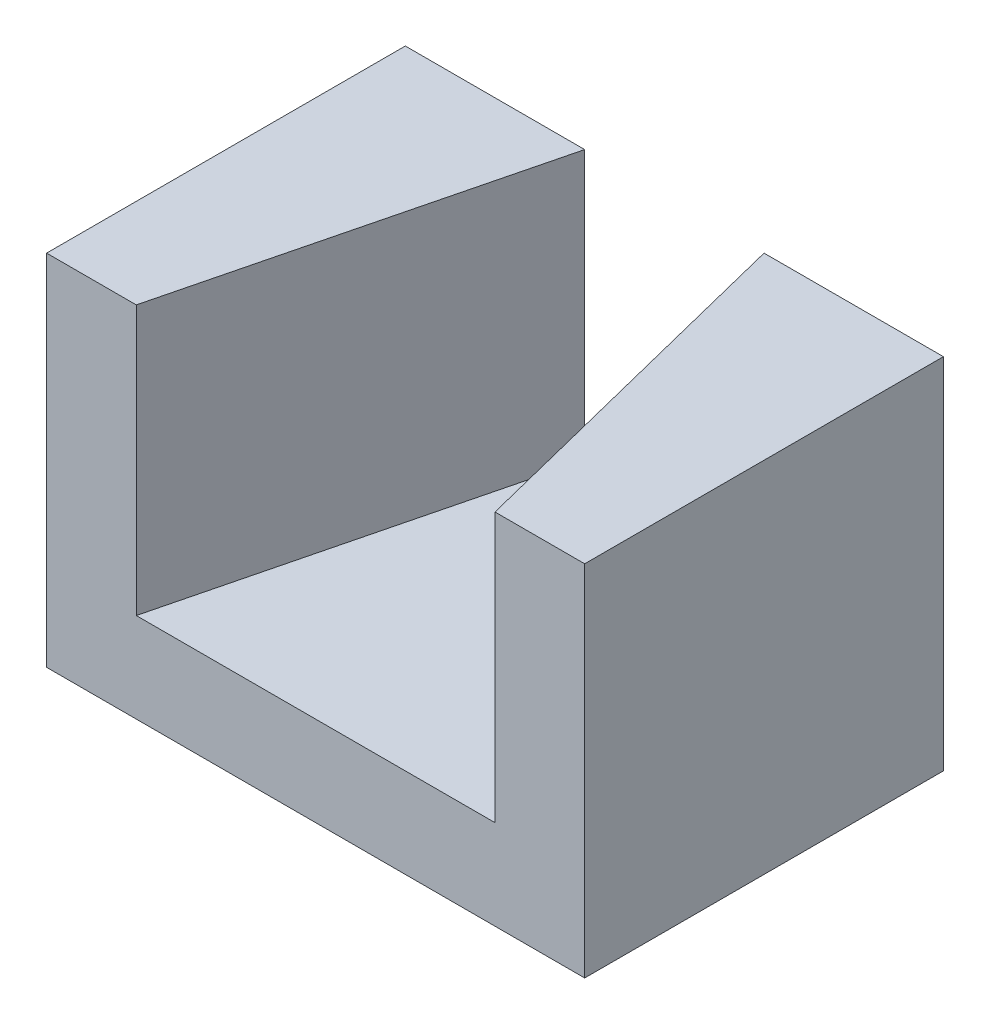
ISO-10303-21;
HEADER;
FILE_DESCRIPTION(('STEP AP214'),'2;1');
FILE_NAME('part.step','',(''),(''),'','','');
FILE_SCHEMA(('AUTOMOTIVE_DESIGN { 1 0 10303 214 1 1 1 1 }'));
ENDSEC;
DATA;
#1=APPLICATION_CONTEXT('core data for automotive mechanical design processes');
#2=APPLICATION_PROTOCOL_DEFINITION('international standard','automotive_design',2000,#1);
#3=PRODUCT_CONTEXT('',#1,'mechanical');
#4=PRODUCT('Part','Part','',(#3));
#5=PRODUCT_RELATED_PRODUCT_CATEGORY('part','',(#4));
#6=PRODUCT_DEFINITION_FORMATION('','',#4);
#7=PRODUCT_DEFINITION_CONTEXT('part definition',#1,'design');
#8=PRODUCT_DEFINITION('design','',#6,#7);
#9=PRODUCT_DEFINITION_SHAPE('','',#8);
#10=(LENGTH_UNIT() NAMED_UNIT(*) SI_UNIT(.MILLI.,.METRE.));
#11=(NAMED_UNIT(*) PLANE_ANGLE_UNIT() SI_UNIT($,.RADIAN.));
#12=(NAMED_UNIT(*) SI_UNIT($,.STERADIAN.) SOLID_ANGLE_UNIT());
#13=UNCERTAINTY_MEASURE_WITH_UNIT(LENGTH_MEASURE(1.E-05),#10,'distance_accuracy_value','');
#14=(GEOMETRIC_REPRESENTATION_CONTEXT(3) GLOBAL_UNCERTAINTY_ASSIGNED_CONTEXT((#13)) GLOBAL_UNIT_ASSIGNED_CONTEXT((#10,
#11,#12)) REPRESENTATION_CONTEXT('',''));
#15=CARTESIAN_POINT('',(0.,0.,0.));
#16=DIRECTION('',(0.,0.,1.));
#17=DIRECTION('',(1.,0.,0.));
#18=AXIS2_PLACEMENT_3D('',#15,#16,#17);
#19=CARTESIAN_POINT('',(0.,-10.,0.));
#20=DIRECTION('',(0.,0.,1.));
#21=DIRECTION('',(1.,0.,0.));
#22=AXIS2_PLACEMENT_3D('',#19,#20,#21);
#23=PLANE('',#22);
#24=DIRECTION('',(1.,0.,0.));
#25=VECTOR('',#24,1.);
#26=CARTESIAN_POINT('',(0.,0.,0.));
#27=LINE('',#26,#25);
#28=CARTESIAN_POINT('',(10.,0.,0.));
#29=VERTEX_POINT('',#28);
#30=CARTESIAN_POINT('',(50.,0.,0.));
#31=VERTEX_POINT('',#30);
#32=EDGE_CURVE('E142',#29,#31,#27,.T.);
#33=ORIENTED_EDGE('',*,*,#32,.F.);
#34=DIRECTION('',(0.,-1.,0.));
#35=VECTOR('',#34,1.);
#36=CARTESIAN_POINT('',(10.,30.,0.));
#37=LINE('',#36,#35);
#38=CARTESIAN_POINT('',(10.,30.,0.));
#39=VERTEX_POINT('',#38);
#40=EDGE_CURVE('E139',#39,#29,#37,.T.);
#41=ORIENTED_EDGE('',*,*,#40,.F.);
#42=DIRECTION('',(1.,0.,0.));
#43=VECTOR('',#42,1.);
#44=CARTESIAN_POINT('',(0.,30.,0.));
#45=LINE('',#44,#43);
#46=CARTESIAN_POINT('',(0.,30.,0.));
#47=VERTEX_POINT('',#46);
#48=EDGE_CURVE('E131',#47,#39,#45,.T.);
#49=ORIENTED_EDGE('',*,*,#48,.F.);
#50=DIRECTION('',(0.,1.,0.));
#51=VECTOR('',#50,1.);
#52=CARTESIAN_POINT('',(0.,-10.,0.));
#53=LINE('',#52,#51);
#54=CARTESIAN_POINT('',(0.,-10.,0.));
#55=VERTEX_POINT('',#54);
#56=EDGE_CURVE('E11',#55,#47,#53,.T.);
#57=ORIENTED_EDGE('',*,*,#56,.F.);
#58=DIRECTION('',(1.,0.,0.));
#59=VECTOR('',#58,1.);
#60=CARTESIAN_POINT('',(0.,-10.,0.));
#61=LINE('',#60,#59);
#62=CARTESIAN_POINT('',(60.,-10.,0.));
#63=VERTEX_POINT('',#62);
#64=EDGE_CURVE('E143',#55,#63,#61,.T.);
#65=ORIENTED_EDGE('',*,*,#64,.T.);
#66=DIRECTION('',(0.,1.,0.));
#67=VECTOR('',#66,1.);
#68=CARTESIAN_POINT('',(60.,-10.,0.));
#69=LINE('',#68,#67);
#70=CARTESIAN_POINT('',(60.,30.,0.));
#71=VERTEX_POINT('',#70);
#72=EDGE_CURVE('E36',#63,#71,#69,.T.);
#73=ORIENTED_EDGE('',*,*,#72,.T.);
#74=DIRECTION('',(1.,0.,0.));
#75=VECTOR('',#74,1.);
#76=CARTESIAN_POINT('',(0.,30.,0.));
#77=LINE('',#76,#75);
#78=CARTESIAN_POINT('',(50.,30.,0.));
#79=VERTEX_POINT('',#78);
#80=EDGE_CURVE('E110',#79,#71,#77,.T.);
#81=ORIENTED_EDGE('',*,*,#80,.F.);
#82=DIRECTION('',(0.,-1.,0.));
#83=VECTOR('',#82,1.);
#84=CARTESIAN_POINT('',(50.,30.,0.));
#85=LINE('',#84,#83);
#86=EDGE_CURVE('E99',#79,#31,#85,.T.);
#87=ORIENTED_EDGE('',*,*,#86,.T.);
#88=EDGE_LOOP('',(#33,#41,#49,#57,#65,#73,#81,#87));
#89=FACE_BOUND('',#88,.T.);
#90=ADVANCED_FACE('F33',(#89),#23,.T.);
#91=CARTESIAN_POINT('',(0.,-10.,0.));
#92=DIRECTION('',(1.,0.,0.));
#93=DIRECTION('',(0.,0.,-1.));
#94=AXIS2_PLACEMENT_3D('',#91,#92,#93);
#95=PLANE('',#94);
#96=ORIENTED_EDGE('',*,*,#56,.T.);
#97=DIRECTION('',(0.,0.,-1.));
#98=VECTOR('',#97,1.);
#99=CARTESIAN_POINT('',(0.,30.,0.));
#100=LINE('',#99,#98);
#101=CARTESIAN_POINT('',(0.,30.,-40.));
#102=VERTEX_POINT('',#101);
#103=EDGE_CURVE('E128',#47,#102,#100,.T.);
#104=ORIENTED_EDGE('',*,*,#103,.T.);
#105=DIRECTION('',(0.,1.,0.));
#106=VECTOR('',#105,1.);
#107=CARTESIAN_POINT('',(0.,-10.,-40.));
#108=LINE('',#107,#106);
#109=CARTESIAN_POINT('',(0.,-10.,-40.));
#110=VERTEX_POINT('',#109);
#111=EDGE_CURVE('E41',#110,#102,#108,.T.);
#112=ORIENTED_EDGE('',*,*,#111,.F.);
#113=DIRECTION('',(0.,0.,-1.));
#114=VECTOR('',#113,1.);
#115=CARTESIAN_POINT('',(0.,-10.,0.));
#116=LINE('',#115,#114);
#117=EDGE_CURVE('E151',#55,#110,#116,.T.);
#118=ORIENTED_EDGE('',*,*,#117,.F.);
#119=EDGE_LOOP('',(#96,#104,#112,#118));
#120=FACE_BOUND('',#119,.T.);
#121=ADVANCED_FACE('F176',(#120),#95,.F.);
#122=CARTESIAN_POINT('',(0.,-10.,-40.));
#123=DIRECTION('',(0.,0.,1.));
#124=DIRECTION('',(1.,0.,0.));
#125=AXIS2_PLACEMENT_3D('',#122,#123,#124);
#126=PLANE('',#125);
#127=ORIENTED_EDGE('',*,*,#111,.T.);
#128=DIRECTION('',(1.,0.,0.));
#129=VECTOR('',#128,1.);
#130=CARTESIAN_POINT('',(0.,30.,-40.));
#131=LINE('',#130,#129);
#132=CARTESIAN_POINT('',(20.,30.,-40.));
#133=VERTEX_POINT('',#132);
#134=EDGE_CURVE('E125',#102,#133,#131,.T.);
#135=ORIENTED_EDGE('',*,*,#134,.T.);
#136=DIRECTION('',(0.,-1.,0.));
#137=VECTOR('',#136,1.);
#138=CARTESIAN_POINT('',(20.,30.,-40.));
#139=LINE('',#138,#137);
#140=CARTESIAN_POINT('',(20.,0.,-40.));
#141=VERTEX_POINT('',#140);
#142=EDGE_CURVE('E135',#133,#141,#139,.T.);
#143=ORIENTED_EDGE('',*,*,#142,.T.);
#144=DIRECTION('',(1.,0.,0.));
#145=VECTOR('',#144,1.);
#146=CARTESIAN_POINT('',(0.,0.,-40.));
#147=LINE('',#146,#145);
#148=CARTESIAN_POINT('',(40.,0.,-40.));
#149=VERTEX_POINT('',#148);
#150=EDGE_CURVE('E146',#141,#149,#147,.T.);
#151=ORIENTED_EDGE('',*,*,#150,.T.);
#152=DIRECTION('',(0.,-1.,0.));
#153=VECTOR('',#152,1.);
#154=CARTESIAN_POINT('',(40.,30.,-40.));
#155=LINE('',#154,#153);
#156=CARTESIAN_POINT('',(40.,30.,-40.));
#157=VERTEX_POINT('',#156);
#158=EDGE_CURVE('E107',#157,#149,#155,.T.);
#159=ORIENTED_EDGE('',*,*,#158,.F.);
#160=DIRECTION('',(1.,0.,0.));
#161=VECTOR('',#160,1.);
#162=CARTESIAN_POINT('',(0.,30.,-40.));
#163=LINE('',#162,#161);
#164=CARTESIAN_POINT('',(60.,30.,-40.));
#165=VERTEX_POINT('',#164);
#166=EDGE_CURVE('E118',#157,#165,#163,.T.);
#167=ORIENTED_EDGE('',*,*,#166,.T.);
#168=DIRECTION('',(0.,1.,0.));
#169=VECTOR('',#168,1.);
#170=CARTESIAN_POINT('',(60.,-10.,-40.));
#171=LINE('',#170,#169);
#172=CARTESIAN_POINT('',(60.,-10.,-40.));
#173=VERTEX_POINT('',#172);
#174=EDGE_CURVE('E156',#173,#165,#171,.T.);
#175=ORIENTED_EDGE('',*,*,#174,.F.);
#176=DIRECTION('',(1.,0.,0.));
#177=VECTOR('',#176,1.);
#178=CARTESIAN_POINT('',(0.,-10.,-40.));
#179=LINE('',#178,#177);
#180=EDGE_CURVE('E149',#110,#173,#179,.T.);
#181=ORIENTED_EDGE('',*,*,#180,.F.);
#182=EDGE_LOOP('',(#127,#135,#143,#151,#159,#167,#175,#181));
#183=FACE_BOUND('',#182,.T.);
#184=ADVANCED_FACE('F163',(#183),#126,.F.);
#185=CARTESIAN_POINT('',(60.,-10.,0.));
#186=DIRECTION('',(1.,0.,0.));
#187=DIRECTION('',(0.,0.,-1.));
#188=AXIS2_PLACEMENT_3D('',#185,#186,#187);
#189=PLANE('',#188);
#190=ORIENTED_EDGE('',*,*,#174,.T.);
#191=DIRECTION('',(0.,0.,-1.));
#192=VECTOR('',#191,1.);
#193=CARTESIAN_POINT('',(60.,30.,0.));
#194=LINE('',#193,#192);
#195=EDGE_CURVE('E114',#71,#165,#194,.T.);
#196=ORIENTED_EDGE('',*,*,#195,.F.);
#197=ORIENTED_EDGE('',*,*,#72,.F.);
#198=DIRECTION('',(0.,0.,-1.));
#199=VECTOR('',#198,1.);
#200=CARTESIAN_POINT('',(60.,-10.,0.));
#201=LINE('',#200,#199);
#202=EDGE_CURVE('E145',#63,#173,#201,.T.);
#203=ORIENTED_EDGE('',*,*,#202,.T.);
#204=EDGE_LOOP('',(#190,#196,#197,#203));
#205=FACE_BOUND('',#204,.T.);
#206=ADVANCED_FACE('F159',(#205),#189,.T.);
#207=CARTESIAN_POINT('',(0.,-10.,0.));
#208=DIRECTION('',(0.,1.,0.));
#209=DIRECTION('',(0.,0.,1.));
#210=AXIS2_PLACEMENT_3D('',#207,#208,#209);
#211=PLANE('',#210);
#212=ORIENTED_EDGE('',*,*,#64,.F.);
#213=ORIENTED_EDGE('',*,*,#117,.T.);
#214=ORIENTED_EDGE('',*,*,#180,.T.);
#215=ORIENTED_EDGE('',*,*,#202,.F.);
#216=EDGE_LOOP('',(#212,#213,#214,#215));
#217=FACE_BOUND('',#216,.T.);
#218=ADVANCED_FACE('F179',(#217),#211,.F.);
#219=CARTESIAN_POINT('',(0.,0.,0.));
#220=DIRECTION('',(0.,1.,0.));
#221=DIRECTION('',(0.,0.,1.));
#222=AXIS2_PLACEMENT_3D('',#219,#220,#221);
#223=PLANE('',#222);
#224=DIRECTION('',(-0.242535625036333,0.,-0.970142500145332));
#225=VECTOR('',#224,1.);
#226=CARTESIAN_POINT('',(47.0588235294117,0.,-11.7647058823529));
#227=LINE('',#226,#225);
#228=EDGE_CURVE('E106',#31,#149,#227,.T.);
#229=ORIENTED_EDGE('',*,*,#228,.T.);
#230=ORIENTED_EDGE('',*,*,#150,.F.);
#231=DIRECTION('',(0.242535625036333,0.,-0.970142500145332));
#232=VECTOR('',#231,1.);
#233=CARTESIAN_POINT('',(9.41176470588235,0.,2.35294117647059));
#234=LINE('',#233,#232);
#235=EDGE_CURVE('E49',#29,#141,#234,.T.);
#236=ORIENTED_EDGE('',*,*,#235,.F.);
#237=ORIENTED_EDGE('',*,*,#32,.T.);
#238=EDGE_LOOP('',(#229,#230,#236,#237));
#239=FACE_BOUND('',#238,.T.);
#240=ADVANCED_FACE('F164',(#239),#223,.T.);
#241=CARTESIAN_POINT('',(9.41176470588235,30.,2.35294117647059));
#242=DIRECTION('',(-0.970142500145332,0.,-0.242535625036333));
#243=DIRECTION('',(-0.242535625036333,0.,0.970142500145332));
#244=AXIS2_PLACEMENT_3D('',#241,#242,#243);
#245=PLANE('',#244);
#246=ORIENTED_EDGE('',*,*,#235,.T.);
#247=ORIENTED_EDGE('',*,*,#142,.F.);
#248=DIRECTION('',(0.242535625036333,0.,-0.970142500145332));
#249=VECTOR('',#248,1.);
#250=CARTESIAN_POINT('',(9.41176470588235,30.,2.35294117647059));
#251=LINE('',#250,#249);
#252=EDGE_CURVE('E133',#39,#133,#251,.T.);
#253=ORIENTED_EDGE('',*,*,#252,.F.);
#254=ORIENTED_EDGE('',*,*,#40,.T.);
#255=EDGE_LOOP('',(#246,#247,#253,#254));
#256=FACE_BOUND('',#255,.T.);
#257=ADVANCED_FACE('F168',(#256),#245,.F.);
#258=CARTESIAN_POINT('',(0.,30.,0.));
#259=DIRECTION('',(0.,1.,0.));
#260=DIRECTION('',(0.,0.,1.));
#261=AXIS2_PLACEMENT_3D('',#258,#259,#260);
#262=PLANE('',#261);
#263=ORIENTED_EDGE('',*,*,#134,.F.);
#264=ORIENTED_EDGE('',*,*,#103,.F.);
#265=ORIENTED_EDGE('',*,*,#48,.T.);
#266=ORIENTED_EDGE('',*,*,#252,.T.);
#267=EDGE_LOOP('',(#263,#264,#265,#266));
#268=FACE_BOUND('',#267,.T.);
#269=ADVANCED_FACE('F172',(#268),#262,.T.);
#270=CARTESIAN_POINT('',(47.0588235294117,30.,-11.7647058823529));
#271=DIRECTION('',(-0.970142500145332,0.,0.242535625036333));
#272=DIRECTION('',(0.242535625036333,0.,0.970142500145332));
#273=AXIS2_PLACEMENT_3D('',#270,#271,#272);
#274=PLANE('',#273);
#275=ORIENTED_EDGE('',*,*,#228,.F.);
#276=ORIENTED_EDGE('',*,*,#86,.F.);
#277=DIRECTION('',(-0.242535625036333,0.,-0.970142500145332));
#278=VECTOR('',#277,1.);
#279=CARTESIAN_POINT('',(47.0588235294117,30.,-11.7647058823529));
#280=LINE('',#279,#278);
#281=EDGE_CURVE('E103',#79,#157,#280,.T.);
#282=ORIENTED_EDGE('',*,*,#281,.T.);
#283=ORIENTED_EDGE('',*,*,#158,.T.);
#284=EDGE_LOOP('',(#275,#276,#282,#283));
#285=FACE_BOUND('',#284,.T.);
#286=ADVANCED_FACE('F101',(#285),#274,.T.);
#287=CARTESIAN_POINT('',(0.,30.,0.));
#288=DIRECTION('',(0.,1.,0.));
#289=DIRECTION('',(0.,0.,1.));
#290=AXIS2_PLACEMENT_3D('',#287,#288,#289);
#291=PLANE('',#290);
#292=ORIENTED_EDGE('',*,*,#281,.F.);
#293=ORIENTED_EDGE('',*,*,#80,.T.);
#294=ORIENTED_EDGE('',*,*,#195,.T.);
#295=ORIENTED_EDGE('',*,*,#166,.F.);
#296=EDGE_LOOP('',(#292,#293,#294,#295));
#297=FACE_BOUND('',#296,.T.);
#298=ADVANCED_FACE('F116',(#297),#291,.T.);
#299=CLOSED_SHELL('',(#90,#121,#184,#206,#218,#240,#257,#269,#286,#298));
#300=MANIFOLD_SOLID_BREP('B2',#299);
#301=ADVANCED_BREP_SHAPE_REPRESENTATION('',(#18,#300),#14);
#302=SHAPE_DEFINITION_REPRESENTATION(#9,#301);
ENDSEC;
END-ISO-10303-21;
